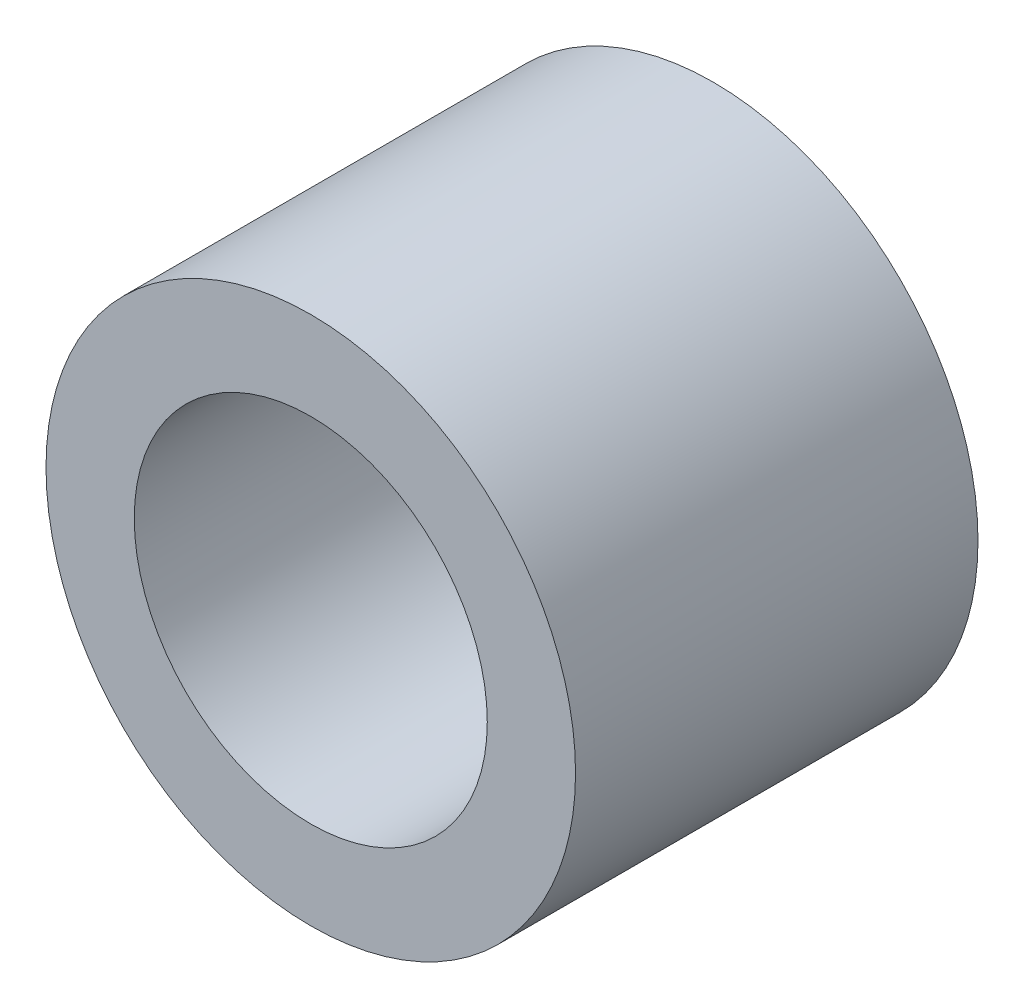
ISO-10303-21;
HEADER;
FILE_DESCRIPTION(('STEP AP214'),'2;1');
FILE_NAME('part.step','',(''),(''),'','','');
FILE_SCHEMA(('AUTOMOTIVE_DESIGN { 1 0 10303 214 1 1 1 1 }'));
ENDSEC;
DATA;
#1=APPLICATION_CONTEXT('core data for automotive mechanical design processes');
#2=APPLICATION_PROTOCOL_DEFINITION('international standard','automotive_design',2000,#1);
#3=PRODUCT_CONTEXT('',#1,'mechanical');
#4=PRODUCT('Part','Part','',(#3));
#5=PRODUCT_RELATED_PRODUCT_CATEGORY('part','',(#4));
#6=PRODUCT_DEFINITION_FORMATION('','',#4);
#7=PRODUCT_DEFINITION_CONTEXT('part definition',#1,'design');
#8=PRODUCT_DEFINITION('design','',#6,#7);
#9=PRODUCT_DEFINITION_SHAPE('','',#8);
#10=(LENGTH_UNIT() NAMED_UNIT(*) SI_UNIT(.MILLI.,.METRE.));
#11=(NAMED_UNIT(*) PLANE_ANGLE_UNIT() SI_UNIT($,.RADIAN.));
#12=(NAMED_UNIT(*) SI_UNIT($,.STERADIAN.) SOLID_ANGLE_UNIT());
#13=UNCERTAINTY_MEASURE_WITH_UNIT(LENGTH_MEASURE(1.E-05),#10,'distance_accuracy_value','');
#14=(GEOMETRIC_REPRESENTATION_CONTEXT(3) GLOBAL_UNCERTAINTY_ASSIGNED_CONTEXT((#13)) GLOBAL_UNIT_ASSIGNED_CONTEXT((#10,
#11,#12)) REPRESENTATION_CONTEXT('',''));
#15=CARTESIAN_POINT('',(0.,0.,0.));
#16=DIRECTION('',(0.,0.,1.));
#17=DIRECTION('',(1.,0.,0.));
#18=AXIS2_PLACEMENT_3D('',#15,#16,#17);
#19=CARTESIAN_POINT('',(0.,5.70000000000346,-5.69999999999999));
#20=DIRECTION('',(0.,6.05626659933023E-13,-1.));
#21=DIRECTION('',(0.,1.,6.05626659933023E-13));
#22=AXIS2_PLACEMENT_3D('',#19,#20,#21);
#23=PLANE('',#22);
#24=CARTESIAN_POINT('',(0.,5.70000000000346,-5.69999999999999));
#25=DIRECTION('',(0.,6.05626659933023E-13,-1.));
#26=DIRECTION('',(0.,1.,6.05626659933023E-13));
#27=AXIS2_PLACEMENT_3D('',#24,#25,#26);
#28=CIRCLE('',#27,7.5);
#29=CARTESIAN_POINT('',(0.,13.2000000000035,-5.69999999999545));
#30=VERTEX_POINT('',#29);
#31=EDGE_CURVE('E10',#30,#30,#28,.T.);
#32=ORIENTED_EDGE('',*,*,#31,.T.);
#33=EDGE_LOOP('',(#32));
#34=FACE_BOUND('',#33,.T.);
#35=CARTESIAN_POINT('',(0.,5.70000000000346,-5.69999999999999));
#36=DIRECTION('',(0.,6.05626659933023E-13,-1.));
#37=DIRECTION('',(0.,1.,6.05626659933023E-13));
#38=AXIS2_PLACEMENT_3D('',#35,#36,#37);
#39=CIRCLE('',#38,5.);
#40=CARTESIAN_POINT('',(0.,10.7000000000035,-5.69999999999696));
#41=VERTEX_POINT('',#40);
#42=EDGE_CURVE('E39',#41,#41,#39,.T.);
#43=ORIENTED_EDGE('',*,*,#42,.F.);
#44=EDGE_LOOP('',(#43));
#45=FACE_BOUND('',#44,.T.);
#46=ADVANCED_FACE('F28',(#34,#45),#23,.T.);
#47=CARTESIAN_POINT('',(0.,5.69999999999655,5.70000000000001));
#48=DIRECTION('',(0.,6.05626659933023E-13,-1.));
#49=DIRECTION('',(0.,1.,6.05626659933023E-13));
#50=AXIS2_PLACEMENT_3D('',#47,#48,#49);
#51=PLANE('',#50);
#52=CARTESIAN_POINT('',(0.,5.69999999999655,5.70000000000001));
#53=DIRECTION('',(0.,6.05626659933023E-13,-1.));
#54=DIRECTION('',(0.,1.,6.05626659933023E-13));
#55=AXIS2_PLACEMENT_3D('',#52,#53,#54);
#56=CIRCLE('',#55,7.5);
#57=CARTESIAN_POINT('',(0.,13.1999999999966,5.70000000000455));
#58=VERTEX_POINT('',#57);
#59=EDGE_CURVE('E32',#58,#58,#56,.T.);
#60=ORIENTED_EDGE('',*,*,#59,.F.);
#61=EDGE_LOOP('',(#60));
#62=FACE_BOUND('',#61,.T.);
#63=CARTESIAN_POINT('',(0.,5.69999999999655,5.70000000000001));
#64=DIRECTION('',(0.,6.05626659933023E-13,-1.));
#65=DIRECTION('',(0.,1.,6.05626659933023E-13));
#66=AXIS2_PLACEMENT_3D('',#63,#64,#65);
#67=CIRCLE('',#66,5.);
#68=CARTESIAN_POINT('',(0.,10.6999999999966,5.70000000000304));
#69=VERTEX_POINT('',#68);
#70=EDGE_CURVE('E41',#69,#69,#67,.T.);
#71=ORIENTED_EDGE('',*,*,#70,.T.);
#72=EDGE_LOOP('',(#71));
#73=FACE_BOUND('',#72,.T.);
#74=ADVANCED_FACE('F51',(#62,#73),#51,.F.);
#75=CARTESIAN_POINT('',(0.,5.70000000000346,-5.69999999999999));
#76=DIRECTION('',(0.,-6.05626659933023E-13,1.));
#77=DIRECTION('',(0.,-1.,-6.05626659933023E-13));
#78=AXIS2_PLACEMENT_3D('',#75,#76,#77);
#79=CYLINDRICAL_SURFACE('',#78,7.5);
#80=ORIENTED_EDGE('',*,*,#31,.F.);
#81=EDGE_LOOP('',(#80));
#82=FACE_BOUND('',#81,.T.);
#83=ORIENTED_EDGE('',*,*,#59,.T.);
#84=EDGE_LOOP('',(#83));
#85=FACE_BOUND('',#84,.T.);
#86=ADVANCED_FACE('F30',(#82,#85),#79,.T.);
#87=CARTESIAN_POINT('',(0.,5.70000000000346,-5.69999999999999));
#88=DIRECTION('',(0.,-6.05626659933023E-13,1.));
#89=DIRECTION('',(0.,-1.,-6.05626659933023E-13));
#90=AXIS2_PLACEMENT_3D('',#87,#88,#89);
#91=CYLINDRICAL_SURFACE('',#90,5.);
#92=ORIENTED_EDGE('',*,*,#42,.T.);
#93=EDGE_LOOP('',(#92));
#94=FACE_BOUND('',#93,.T.);
#95=ORIENTED_EDGE('',*,*,#70,.F.);
#96=EDGE_LOOP('',(#95));
#97=FACE_BOUND('',#96,.T.);
#98=ADVANCED_FACE('F47',(#94,#97),#91,.F.);
#99=CLOSED_SHELL('',(#46,#74,#86,#98));
#100=MANIFOLD_SOLID_BREP('B2',#99);
#101=ADVANCED_BREP_SHAPE_REPRESENTATION('',(#18,#100),#14);
#102=SHAPE_DEFINITION_REPRESENTATION(#9,#101);
ENDSEC;
END-ISO-10303-21;
